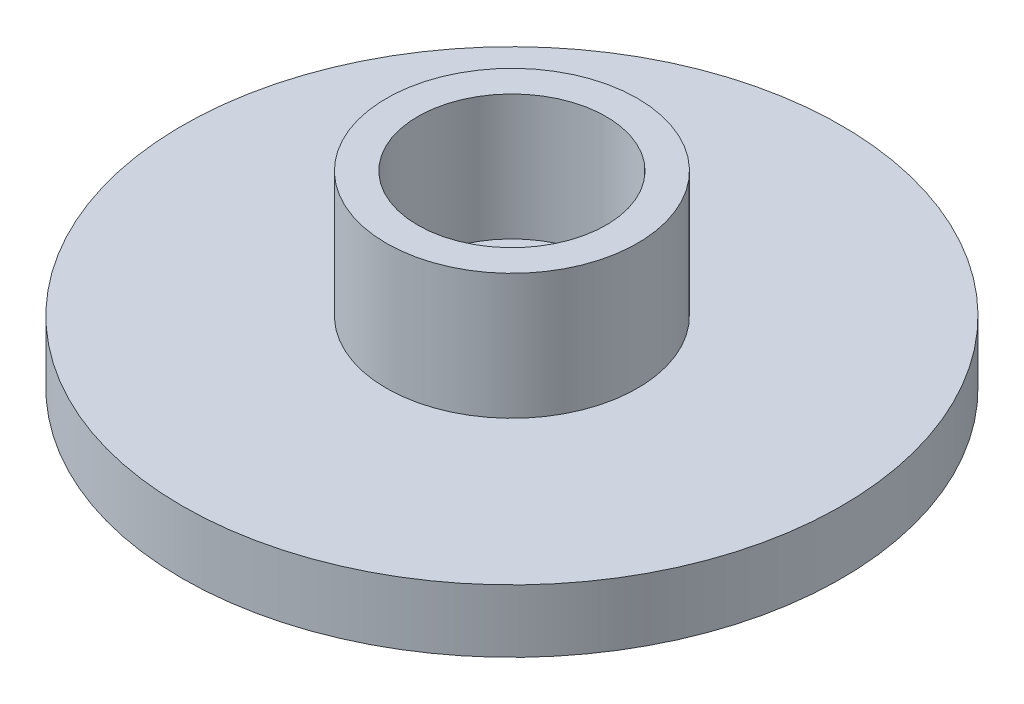
ISO-10303-21;
HEADER;
FILE_DESCRIPTION(('STEP AP214'),'2;1');
FILE_NAME('part.step','',(''),(''),'','','');
FILE_SCHEMA(('AUTOMOTIVE_DESIGN { 1 0 10303 214 1 1 1 1 }'));
ENDSEC;
DATA;
#1=APPLICATION_CONTEXT('core data for automotive mechanical design processes');
#2=APPLICATION_PROTOCOL_DEFINITION('international standard','automotive_design',2000,#1);
#3=PRODUCT_CONTEXT('',#1,'mechanical');
#4=PRODUCT('Part','Part','',(#3));
#5=PRODUCT_RELATED_PRODUCT_CATEGORY('part','',(#4));
#6=PRODUCT_DEFINITION_FORMATION('','',#4);
#7=PRODUCT_DEFINITION_CONTEXT('part definition',#1,'design');
#8=PRODUCT_DEFINITION('design','',#6,#7);
#9=PRODUCT_DEFINITION_SHAPE('','',#8);
#10=(LENGTH_UNIT() NAMED_UNIT(*) SI_UNIT(.MILLI.,.METRE.));
#11=(NAMED_UNIT(*) PLANE_ANGLE_UNIT() SI_UNIT($,.RADIAN.));
#12=(NAMED_UNIT(*) SI_UNIT($,.STERADIAN.) SOLID_ANGLE_UNIT());
#13=UNCERTAINTY_MEASURE_WITH_UNIT(LENGTH_MEASURE(1.E-05),#10,'distance_accuracy_value','');
#14=(GEOMETRIC_REPRESENTATION_CONTEXT(3) GLOBAL_UNCERTAINTY_ASSIGNED_CONTEXT((#13)) GLOBAL_UNIT_ASSIGNED_CONTEXT((#10,
#11,#12)) REPRESENTATION_CONTEXT('',''));
#15=CARTESIAN_POINT('',(0.,0.,0.));
#16=DIRECTION('',(0.,0.,1.));
#17=DIRECTION('',(1.,0.,0.));
#18=AXIS2_PLACEMENT_3D('',#15,#16,#17);
#19=CARTESIAN_POINT('',(0.,2.,0.));
#20=DIRECTION('',(0.,1.,0.));
#21=DIRECTION('',(0.,0.,1.));
#22=AXIS2_PLACEMENT_3D('',#19,#20,#21);
#23=PLANE('',#22);
#24=CARTESIAN_POINT('',(0.,2.,0.));
#25=DIRECTION('',(0.,1.,0.));
#26=DIRECTION('',(0.,0.,1.));
#27=AXIS2_PLACEMENT_3D('',#24,#25,#26);
#28=CIRCLE('',#27,10.5);
#29=CARTESIAN_POINT('',(0.,2.,10.5));
#30=VERTEX_POINT('',#29);
#31=EDGE_CURVE('E10',#30,#30,#28,.T.);
#32=ORIENTED_EDGE('',*,*,#31,.T.);
#33=EDGE_LOOP('',(#32));
#34=FACE_BOUND('',#33,.T.);
#35=CARTESIAN_POINT('',(0.,2.,0.));
#36=DIRECTION('',(0.,1.,0.));
#37=DIRECTION('',(0.,0.,1.));
#38=AXIS2_PLACEMENT_3D('',#35,#36,#37);
#39=CIRCLE('',#38,4.);
#40=CARTESIAN_POINT('',(0.,2.,4.));
#41=VERTEX_POINT('',#40);
#42=EDGE_CURVE('E43',#41,#41,#39,.T.);
#43=ORIENTED_EDGE('',*,*,#42,.F.);
#44=EDGE_LOOP('',(#43));
#45=FACE_BOUND('',#44,.T.);
#46=ADVANCED_FACE('F30',(#34,#45),#23,.T.);
#47=CARTESIAN_POINT('',(0.,2.,0.));
#48=DIRECTION('',(0.,-1.,0.));
#49=DIRECTION('',(0.,0.,-1.));
#50=AXIS2_PLACEMENT_3D('',#47,#48,#49);
#51=CYLINDRICAL_SURFACE('',#50,10.5);
#52=ORIENTED_EDGE('',*,*,#31,.F.);
#53=EDGE_LOOP('',(#52));
#54=FACE_BOUND('',#53,.T.);
#55=CARTESIAN_POINT('',(0.,0.,0.));
#56=DIRECTION('',(0.,1.,0.));
#57=DIRECTION('',(0.,0.,1.));
#58=AXIS2_PLACEMENT_3D('',#55,#56,#57);
#59=CIRCLE('',#58,10.5);
#60=CARTESIAN_POINT('',(0.,0.,10.5));
#61=VERTEX_POINT('',#60);
#62=EDGE_CURVE('E34',#61,#61,#59,.T.);
#63=ORIENTED_EDGE('',*,*,#62,.T.);
#64=EDGE_LOOP('',(#63));
#65=FACE_BOUND('',#64,.T.);
#66=ADVANCED_FACE('F32',(#54,#65),#51,.T.);
#67=CARTESIAN_POINT('',(0.,0.,0.));
#68=DIRECTION('',(0.,1.,0.));
#69=DIRECTION('',(0.,0.,1.));
#70=AXIS2_PLACEMENT_3D('',#67,#68,#69);
#71=PLANE('',#70);
#72=ORIENTED_EDGE('',*,*,#62,.F.);
#73=EDGE_LOOP('',(#72));
#74=FACE_BOUND('',#73,.T.);
#75=ADVANCED_FACE('F72',(#74),#71,.F.);
#76=CARTESIAN_POINT('',(0.,6.,0.));
#77=DIRECTION('',(0.,-1.,0.));
#78=DIRECTION('',(0.,0.,-1.));
#79=AXIS2_PLACEMENT_3D('',#76,#77,#78);
#80=CYLINDRICAL_SURFACE('',#79,4.);
#81=CARTESIAN_POINT('',(0.,6.,0.));
#82=DIRECTION('',(0.,1.,0.));
#83=DIRECTION('',(0.,0.,1.));
#84=AXIS2_PLACEMENT_3D('',#81,#82,#83);
#85=CIRCLE('',#84,4.);
#86=CARTESIAN_POINT('',(0.,6.,4.));
#87=VERTEX_POINT('',#86);
#88=EDGE_CURVE('E41',#87,#87,#85,.T.);
#89=ORIENTED_EDGE('',*,*,#88,.F.);
#90=EDGE_LOOP('',(#89));
#91=FACE_BOUND('',#90,.T.);
#92=ORIENTED_EDGE('',*,*,#42,.T.);
#93=EDGE_LOOP('',(#92));
#94=FACE_BOUND('',#93,.T.);
#95=ADVANCED_FACE('F66',(#91,#94),#80,.T.);
#96=CARTESIAN_POINT('',(0.,6.,0.));
#97=DIRECTION('',(0.,1.,0.));
#98=DIRECTION('',(0.,0.,1.));
#99=AXIS2_PLACEMENT_3D('',#96,#97,#98);
#100=PLANE('',#99);
#101=CARTESIAN_POINT('',(0.,6.,0.));
#102=DIRECTION('',(0.,1.,0.));
#103=DIRECTION('',(0.,0.,1.));
#104=AXIS2_PLACEMENT_3D('',#101,#102,#103);
#105=CIRCLE('',#104,3.);
#106=CARTESIAN_POINT('',(0.,6.,3.));
#107=VERTEX_POINT('',#106);
#108=EDGE_CURVE('E49',#107,#107,#105,.T.);
#109=ORIENTED_EDGE('',*,*,#108,.F.);
#110=EDGE_LOOP('',(#109));
#111=FACE_BOUND('',#110,.T.);
#112=ORIENTED_EDGE('',*,*,#88,.T.);
#113=EDGE_LOOP('',(#112));
#114=FACE_BOUND('',#113,.T.);
#115=ADVANCED_FACE('F60',(#111,#114),#100,.T.);
#116=CARTESIAN_POINT('',(0.,2.,0.));
#117=DIRECTION('',(0.,1.,0.));
#118=DIRECTION('',(0.,0.,1.));
#119=AXIS2_PLACEMENT_3D('',#116,#117,#118);
#120=CYLINDRICAL_SURFACE('',#119,3.);
#121=CARTESIAN_POINT('',(0.,2.,0.));
#122=DIRECTION('',(0.,1.,0.));
#123=DIRECTION('',(0.,0.,1.));
#124=AXIS2_PLACEMENT_3D('',#121,#122,#123);
#125=CIRCLE('',#124,3.);
#126=CARTESIAN_POINT('',(0.,2.,3.));
#127=VERTEX_POINT('',#126);
#128=EDGE_CURVE('E46',#127,#127,#125,.T.);
#129=ORIENTED_EDGE('',*,*,#128,.F.);
#130=EDGE_LOOP('',(#129));
#131=FACE_BOUND('',#130,.T.);
#132=ORIENTED_EDGE('',*,*,#108,.T.);
#133=EDGE_LOOP('',(#132));
#134=FACE_BOUND('',#133,.T.);
#135=ADVANCED_FACE('F57',(#131,#134),#120,.F.);
#136=CARTESIAN_POINT('',(0.,2.,0.));
#137=DIRECTION('',(0.,1.,0.));
#138=DIRECTION('',(0.,0.,1.));
#139=AXIS2_PLACEMENT_3D('',#136,#137,#138);
#140=PLANE('',#139);
#141=ORIENTED_EDGE('',*,*,#128,.T.);
#142=EDGE_LOOP('',(#141));
#143=FACE_BOUND('',#142,.T.);
#144=ADVANCED_FACE('F55',(#143),#140,.T.);
#145=CLOSED_SHELL('',(#46,#66,#75,#95,#115,#135,#144));
#146=MANIFOLD_SOLID_BREP('B2',#145);
#147=ADVANCED_BREP_SHAPE_REPRESENTATION('',(#18,#146),#14);
#148=SHAPE_DEFINITION_REPRESENTATION(#9,#147);
ENDSEC;
END-ISO-10303-21;
